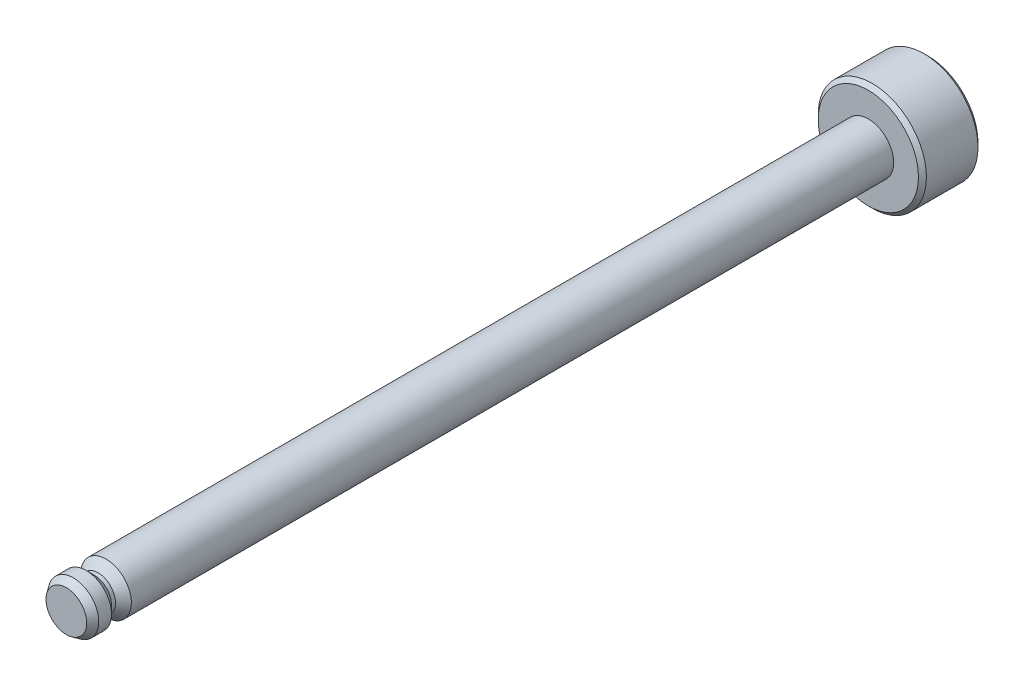
ISO-10303-21;
HEADER;
FILE_DESCRIPTION(('STEP AP214'),'2;1');
FILE_NAME('part.step','',(''),(''),'','','');
FILE_SCHEMA(('AUTOMOTIVE_DESIGN { 1 0 10303 214 1 1 1 1 }'));
ENDSEC;
DATA;
#1=APPLICATION_CONTEXT('core data for automotive mechanical design processes');
#2=APPLICATION_PROTOCOL_DEFINITION('international standard','automotive_design',2000,#1);
#3=PRODUCT_CONTEXT('',#1,'mechanical');
#4=PRODUCT('Part','Part','',(#3));
#5=PRODUCT_RELATED_PRODUCT_CATEGORY('part','',(#4));
#6=PRODUCT_DEFINITION_FORMATION('','',#4);
#7=PRODUCT_DEFINITION_CONTEXT('part definition',#1,'design');
#8=PRODUCT_DEFINITION('design','',#6,#7);
#9=PRODUCT_DEFINITION_SHAPE('','',#8);
#10=(LENGTH_UNIT() NAMED_UNIT(*) SI_UNIT(.MILLI.,.METRE.));
#11=(NAMED_UNIT(*) PLANE_ANGLE_UNIT() SI_UNIT($,.RADIAN.));
#12=(NAMED_UNIT(*) SI_UNIT($,.STERADIAN.) SOLID_ANGLE_UNIT());
#13=UNCERTAINTY_MEASURE_WITH_UNIT(LENGTH_MEASURE(1.E-05),#10,'distance_accuracy_value','');
#14=(GEOMETRIC_REPRESENTATION_CONTEXT(3) GLOBAL_UNCERTAINTY_ASSIGNED_CONTEXT((#13)) GLOBAL_UNIT_ASSIGNED_CONTEXT((#10,
#11,#12)) REPRESENTATION_CONTEXT('',''));
#15=CARTESIAN_POINT('',(0.,0.,0.));
#16=DIRECTION('',(0.,0.,1.));
#17=DIRECTION('',(1.,0.,0.));
#18=AXIS2_PLACEMENT_3D('',#15,#16,#17);
#19=CARTESIAN_POINT('',(0.,0.,40.4));
#20=DIRECTION('',(0.,0.,-1.));
#21=DIRECTION('',(-1.,0.,0.));
#22=AXIS2_PLACEMENT_3D('',#19,#20,#21);
#23=CYLINDRICAL_SURFACE('',#22,1.275);
#24=CARTESIAN_POINT('',(0.,0.,38.4));
#25=DIRECTION('',(0.,0.,-1.));
#26=DIRECTION('',(0.,1.,0.));
#27=AXIS2_PLACEMENT_3D('',#24,#25,#26);
#28=CIRCLE('',#27,1.275);
#29=CARTESIAN_POINT('',(0.,1.275,38.4));
#30=VERTEX_POINT('',#29);
#31=EDGE_CURVE('E74',#30,#30,#28,.T.);
#32=ORIENTED_EDGE('',*,*,#31,.T.);
#33=EDGE_LOOP('',(#32));
#34=FACE_BOUND('',#33,.T.);
#35=CARTESIAN_POINT('',(0.,0.,0.));
#36=DIRECTION('',(0.,0.,1.));
#37=DIRECTION('',(1.,0.,0.));
#38=AXIS2_PLACEMENT_3D('',#35,#36,#37);
#39=CIRCLE('',#38,1.275);
#40=CARTESIAN_POINT('',(1.275,0.,0.));
#41=VERTEX_POINT('',#40);
#42=EDGE_CURVE('E68',#41,#41,#39,.T.);
#43=ORIENTED_EDGE('',*,*,#42,.T.);
#44=EDGE_LOOP('',(#43));
#45=FACE_BOUND('',#44,.T.);
#46=ADVANCED_FACE('F39',(#34,#45),#23,.T.);
#47=CARTESIAN_POINT('',(0.,0.,-3.));
#48=DIRECTION('',(0.,0.,1.));
#49=DIRECTION('',(1.,0.,0.));
#50=AXIS2_PLACEMENT_3D('',#47,#48,#49);
#51=CYLINDRICAL_SURFACE('',#50,2.725);
#52=CARTESIAN_POINT('',(0.,0.,-0.200000000000001));
#53=DIRECTION('',(0.,0.,1.));
#54=DIRECTION('',(1.,0.,0.));
#55=AXIS2_PLACEMENT_3D('',#52,#53,#54);
#56=CIRCLE('',#55,2.725);
#57=CARTESIAN_POINT('',(2.725,0.,-0.200000000000001));
#58=VERTEX_POINT('',#57);
#59=EDGE_CURVE('E50',#58,#58,#56,.F.);
#60=ORIENTED_EDGE('',*,*,#59,.T.);
#61=EDGE_LOOP('',(#60));
#62=FACE_BOUND('',#61,.T.);
#63=CARTESIAN_POINT('',(0.,0.,-2.8));
#64=DIRECTION('',(0.,0.,1.));
#65=DIRECTION('',(1.,0.,0.));
#66=AXIS2_PLACEMENT_3D('',#63,#64,#65);
#67=CIRCLE('',#66,2.725);
#68=CARTESIAN_POINT('',(2.725,0.,-2.8));
#69=VERTEX_POINT('',#68);
#70=EDGE_CURVE('E51',#69,#69,#67,.T.);
#71=ORIENTED_EDGE('',*,*,#70,.T.);
#72=EDGE_LOOP('',(#71));
#73=FACE_BOUND('',#72,.T.);
#74=ADVANCED_FACE('F117',(#62,#73),#51,.T.);
#75=CARTESIAN_POINT('',(0.,0.,-3.));
#76=DIRECTION('',(0.,0.,1.));
#77=DIRECTION('',(1.,0.,0.));
#78=AXIS2_PLACEMENT_3D('',#75,#76,#77);
#79=PLANE('',#78);
#80=CARTESIAN_POINT('',(0.,0.,-3.));
#81=DIRECTION('',(0.,0.,1.));
#82=DIRECTION('',(1.,0.,0.));
#83=AXIS2_PLACEMENT_3D('',#80,#81,#82);
#84=CIRCLE('',#83,2.525);
#85=CARTESIAN_POINT('',(2.525,0.,-3.));
#86=VERTEX_POINT('',#85);
#87=EDGE_CURVE('E10',#86,#86,#84,.F.);
#88=ORIENTED_EDGE('',*,*,#87,.T.);
#89=EDGE_LOOP('',(#88));
#90=FACE_BOUND('',#89,.T.);
#91=ADVANCED_FACE('F121',(#90),#79,.F.);
#92=CARTESIAN_POINT('',(0.,0.,0.));
#93=DIRECTION('',(0.,0.,1.));
#94=DIRECTION('',(1.,0.,0.));
#95=AXIS2_PLACEMENT_3D('',#92,#93,#94);
#96=PLANE('',#95);
#97=CARTESIAN_POINT('',(0.,0.,0.));
#98=DIRECTION('',(0.,0.,1.));
#99=DIRECTION('',(1.,0.,0.));
#100=AXIS2_PLACEMENT_3D('',#97,#98,#99);
#101=CIRCLE('',#100,2.525);
#102=CARTESIAN_POINT('',(2.525,0.,0.));
#103=VERTEX_POINT('',#102);
#104=EDGE_CURVE('E54',#103,#103,#101,.T.);
#105=ORIENTED_EDGE('',*,*,#104,.T.);
#106=EDGE_LOOP('',(#105));
#107=FACE_BOUND('',#106,.T.);
#108=ORIENTED_EDGE('',*,*,#42,.F.);
#109=EDGE_LOOP('',(#108));
#110=FACE_BOUND('',#109,.T.);
#111=ADVANCED_FACE('F135',(#107,#110),#96,.T.);
#112=CARTESIAN_POINT('',(0.,0.,0.));
#113=DIRECTION('',(0.,0.,-1.));
#114=DIRECTION('',(-1.,0.,0.));
#115=AXIS2_PLACEMENT_3D('',#112,#113,#114);
#116=CONICAL_SURFACE('',#115,2.525,0.785398163397446);
#117=ORIENTED_EDGE('',*,*,#59,.F.);
#118=EDGE_LOOP('',(#117));
#119=FACE_BOUND('',#118,.T.);
#120=ORIENTED_EDGE('',*,*,#104,.F.);
#121=EDGE_LOOP('',(#120));
#122=FACE_BOUND('',#121,.T.);
#123=ADVANCED_FACE('F128',(#119,#122),#116,.T.);
#124=CARTESIAN_POINT('',(0.,0.,-2.8));
#125=DIRECTION('',(0.,0.,1.));
#126=DIRECTION('',(1.,0.,0.));
#127=AXIS2_PLACEMENT_3D('',#124,#125,#126);
#128=CONICAL_SURFACE('',#127,2.725,0.785398163397449);
#129=ORIENTED_EDGE('',*,*,#87,.F.);
#130=EDGE_LOOP('',(#129));
#131=FACE_BOUND('',#130,.T.);
#132=ORIENTED_EDGE('',*,*,#70,.F.);
#133=EDGE_LOOP('',(#132));
#134=FACE_BOUND('',#133,.T.);
#135=ADVANCED_FACE('F45',(#131,#134),#128,.T.);
#136=CARTESIAN_POINT('',(0.,0.,0.));
#137=DIRECTION('',(0.,0.,-1.));
#138=DIRECTION('',(0.,1.,0.));
#139=AXIS2_PLACEMENT_3D('',#136,#137,#138);
#140=CYLINDRICAL_SURFACE('',#139,0.875000000000015);
#141=CARTESIAN_POINT('',(0.,0.,38.8));
#142=DIRECTION('',(0.,0.,-1.));
#143=DIRECTION('',(0.,1.,0.));
#144=AXIS2_PLACEMENT_3D('',#141,#142,#143);
#145=CIRCLE('',#144,0.875000000000015);
#146=CARTESIAN_POINT('',(0.,0.87500000000001,38.8));
#147=VERTEX_POINT('',#146);
#148=EDGE_CURVE('E76',#147,#147,#145,.T.);
#149=ORIENTED_EDGE('',*,*,#148,.F.);
#150=EDGE_LOOP('',(#149));
#151=FACE_BOUND('',#150,.T.);
#152=CARTESIAN_POINT('',(0.,0.,39.));
#153=DIRECTION('',(0.,0.,-1.));
#154=DIRECTION('',(0.,1.,0.));
#155=AXIS2_PLACEMENT_3D('',#152,#153,#154);
#156=CIRCLE('',#155,0.875000000000015);
#157=CARTESIAN_POINT('',(0.,0.87500000000001,39.));
#158=VERTEX_POINT('',#157);
#159=EDGE_CURVE('E70',#158,#158,#156,.T.);
#160=ORIENTED_EDGE('',*,*,#159,.T.);
#161=EDGE_LOOP('',(#160));
#162=FACE_BOUND('',#161,.T.);
#163=ADVANCED_FACE('F81',(#151,#162),#140,.T.);
#164=CARTESIAN_POINT('',(0.,0.,39.4));
#165=DIRECTION('',(0.,0.,1.));
#166=DIRECTION('',(0.,-1.,0.));
#167=AXIS2_PLACEMENT_3D('',#164,#165,#166);
#168=CONICAL_SURFACE('',#167,1.275,0.785398163397448);
#169=ORIENTED_EDGE('',*,*,#159,.F.);
#170=EDGE_LOOP('',(#169));
#171=FACE_BOUND('',#170,.T.);
#172=CARTESIAN_POINT('',(0.,0.,39.4));
#173=DIRECTION('',(0.,0.,-1.));
#174=DIRECTION('',(0.,1.,0.));
#175=AXIS2_PLACEMENT_3D('',#172,#173,#174);
#176=CIRCLE('',#175,1.275);
#177=CARTESIAN_POINT('',(0.,1.275,39.4));
#178=VERTEX_POINT('',#177);
#179=EDGE_CURVE('E75',#178,#178,#176,.T.);
#180=ORIENTED_EDGE('',*,*,#179,.T.);
#181=EDGE_LOOP('',(#180));
#182=FACE_BOUND('',#181,.T.);
#183=ADVANCED_FACE('F90',(#171,#182),#168,.T.);
#184=CARTESIAN_POINT('',(0.,0.,38.8));
#185=DIRECTION('',(0.,0.,-1.));
#186=DIRECTION('',(0.,1.,0.));
#187=AXIS2_PLACEMENT_3D('',#184,#185,#186);
#188=CONICAL_SURFACE('',#187,0.875000000000015,0.785398163397448);
#189=ORIENTED_EDGE('',*,*,#31,.F.);
#190=EDGE_LOOP('',(#189));
#191=FACE_BOUND('',#190,.T.);
#192=ORIENTED_EDGE('',*,*,#148,.T.);
#193=EDGE_LOOP('',(#192));
#194=FACE_BOUND('',#193,.T.);
#195=ADVANCED_FACE('F85',(#191,#194),#188,.T.);
#196=CARTESIAN_POINT('',(0.,0.,40.4));
#197=DIRECTION('',(0.,0.,1.));
#198=DIRECTION('',(1.,0.,0.));
#199=AXIS2_PLACEMENT_3D('',#196,#197,#198);
#200=PLANE('',#199);
#201=CARTESIAN_POINT('',(0.,0.,40.4));
#202=DIRECTION('',(0.,0.,1.));
#203=DIRECTION('',(1.,0.,0.));
#204=AXIS2_PLACEMENT_3D('',#201,#202,#203);
#205=CIRCLE('',#204,1.02499999999999);
#206=CARTESIAN_POINT('',(-1.02499999999999,0.,40.4));
#207=VERTEX_POINT('',#206);
#208=EDGE_CURVE('E64',#207,#207,#205,.T.);
#209=ORIENTED_EDGE('',*,*,#208,.T.);
#210=EDGE_LOOP('',(#209));
#211=FACE_BOUND('',#210,.T.);
#212=ADVANCED_FACE('F102',(#211),#200,.T.);
#213=CARTESIAN_POINT('',(0.,0.,40.4));
#214=DIRECTION('',(0.,0.,-1.));
#215=DIRECTION('',(-1.,0.,0.));
#216=AXIS2_PLACEMENT_3D('',#213,#214,#215);
#217=CONICAL_SURFACE('',#216,1.02499999999999,0.610865238198019);
#218=CARTESIAN_POINT('',(0.,0.,40.0429629983145));
#219=DIRECTION('',(0.,0.,1.));
#220=DIRECTION('',(1.,0.,0.));
#221=AXIS2_PLACEMENT_3D('',#218,#219,#220);
#222=CIRCLE('',#221,1.275);
#223=CARTESIAN_POINT('',(-1.275,0.,40.0429629983145));
#224=VERTEX_POINT('',#223);
#225=EDGE_CURVE('E58',#224,#224,#222,.F.);
#226=CARTESIAN_POINT('',(-1.275,0.,40.0429629983145));
#227=CARTESIAN_POINT('',(-1.27239583333334,0.,40.0466821337487));
#228=CARTESIAN_POINT('',(-1.26979166666667,0.,40.0504012691829));
#229=CARTESIAN_POINT('',(-1.26458333333334,0.,40.0578395400514));
#230=CARTESIAN_POINT('',(-1.26197916666667,0.,40.0615586754856));
#231=CARTESIAN_POINT('',(-1.25677083333333,0.,40.068996946354));
#232=CARTESIAN_POINT('',(-1.25416666666667,0.,40.0727160817883));
#233=CARTESIAN_POINT('',(-1.24895833333334,0.,40.0801543526567));
#234=CARTESIAN_POINT('',(-1.24635416666667,0.,40.0838734880909));
#235=CARTESIAN_POINT('',(-1.24114583333333,0.,40.0913117589594));
#236=CARTESIAN_POINT('',(-1.23854166666667,0.,40.0950308943936));
#237=CARTESIAN_POINT('',(-1.23333333333333,0.,40.1024691652621));
#238=CARTESIAN_POINT('',(-1.23072916666667,0.,40.1061883006963));
#239=CARTESIAN_POINT('',(-1.22552083333333,0.,40.1136265715647));
#240=CARTESIAN_POINT('',(-1.22291666666667,0.,40.1173457069989));
#241=CARTESIAN_POINT('',(-1.21770833333333,0.,40.1247839778674));
#242=CARTESIAN_POINT('',(-1.21510416666667,0.,40.1285031133016));
#243=CARTESIAN_POINT('',(-1.20989583333333,0.,40.1359413841701));
#244=CARTESIAN_POINT('',(-1.20729166666667,0.,40.1396605196043));
#245=CARTESIAN_POINT('',(-1.20208333333333,0.,40.1470987904727));
#246=CARTESIAN_POINT('',(-1.19947916666667,0.,40.150817925907));
#247=CARTESIAN_POINT('',(-1.19427083333333,0.,40.1582561967754));
#248=CARTESIAN_POINT('',(-1.19166666666667,0.,40.1619753322096));
#249=CARTESIAN_POINT('',(-1.18645833333333,0.,40.1694136030781));
#250=CARTESIAN_POINT('',(-1.18385416666667,0.,40.1731327385123));
#251=CARTESIAN_POINT('',(-1.17864583333333,0.,40.1805710093808));
#252=CARTESIAN_POINT('',(-1.17604166666667,0.,40.184290144815));
#253=CARTESIAN_POINT('',(-1.17083333333333,0.,40.1917284156834));
#254=CARTESIAN_POINT('',(-1.16822916666666,0.,40.1954475511177));
#255=CARTESIAN_POINT('',(-1.16302083333333,0.,40.2028858219861));
#256=CARTESIAN_POINT('',(-1.16041666666667,0.,40.2066049574203));
#257=CARTESIAN_POINT('',(-1.15520833333333,0.,40.2140432282888));
#258=CARTESIAN_POINT('',(-1.15260416666667,0.,40.217762363723));
#259=CARTESIAN_POINT('',(-1.14739583333333,0.,40.2252006345915));
#260=CARTESIAN_POINT('',(-1.14479166666666,0.,40.2289197700257));
#261=CARTESIAN_POINT('',(-1.13958333333333,0.,40.2363580408941));
#262=CARTESIAN_POINT('',(-1.13697916666666,0.,40.2400771763283));
#263=CARTESIAN_POINT('',(-1.13177083333333,0.,40.2475154471968));
#264=CARTESIAN_POINT('',(-1.12916666666666,0.,40.251234582631));
#265=CARTESIAN_POINT('',(-1.12395833333333,0.,40.2586728534995));
#266=CARTESIAN_POINT('',(-1.12135416666666,0.,40.2623919889337));
#267=CARTESIAN_POINT('',(-1.11614583333333,0.,40.2698302598021));
#268=CARTESIAN_POINT('',(-1.11354166666666,0.,40.2735493952364));
#269=CARTESIAN_POINT('',(-1.10833333333333,0.,40.2809876661048));
#270=CARTESIAN_POINT('',(-1.10572916666666,0.,40.284706801539));
#271=CARTESIAN_POINT('',(-1.10052083333333,0.,40.2921450724075));
#272=CARTESIAN_POINT('',(-1.09791666666666,0.,40.2958642078417));
#273=CARTESIAN_POINT('',(-1.09270833333333,0.,40.3033024787102));
#274=CARTESIAN_POINT('',(-1.09010416666666,0.,40.3070216141444));
#275=CARTESIAN_POINT('',(-1.08489583333333,0.,40.3144598850128));
#276=CARTESIAN_POINT('',(-1.08229166666666,0.,40.3181790204471));
#277=CARTESIAN_POINT('',(-1.07708333333333,0.,40.3256172913155));
#278=CARTESIAN_POINT('',(-1.07447916666666,0.,40.3293364267497));
#279=CARTESIAN_POINT('',(-1.06927083333333,0.,40.3367746976182));
#280=CARTESIAN_POINT('',(-1.06666666666666,0.,40.3404938330524));
#281=CARTESIAN_POINT('',(-1.06145833333333,0.,40.3479321039209));
#282=CARTESIAN_POINT('',(-1.05885416666666,0.,40.3516512393551));
#283=CARTESIAN_POINT('',(-1.05364583333333,0.,40.3590895102235));
#284=CARTESIAN_POINT('',(-1.05104166666666,0.,40.3628086456578));
#285=CARTESIAN_POINT('',(-1.04583333333333,0.,40.3702469165262));
#286=CARTESIAN_POINT('',(-1.04322916666666,0.,40.3739660519604));
#287=CARTESIAN_POINT('',(-1.03802083333333,0.,40.3814043228289));
#288=CARTESIAN_POINT('',(-1.03541666666666,0.,40.3851234582631));
#289=CARTESIAN_POINT('',(-1.03020833333333,0.,40.3925617291316));
#290=CARTESIAN_POINT('',(-1.02760416666666,0.,40.3962808645658));
#291=CARTESIAN_POINT('',(-1.02499999999999,0.,40.4));
#292=B_SPLINE_CURVE_WITH_KNOTS('',3,(#226,#227,#228,#229,#230,#231,#232,#233,#234,#235,#236,
#237,#238,#239,#240,#241,#242,#243,#244,#245,#246,#247,#248,#249,#250,#251,#252,#253,#254,#255,
#256,#257,#258,#259,#260,#261,#262,#263,#264,#265,#266,#267,#268,#269,#270,#271,#272,#273,#274,
#275,#276,#277,#278,#279,#280,#281,#282,#283,#284,#285,#286,#287,#288,#289,#290,#291),
.UNSPECIFIED.,.F.,.F.,(4,2,2,2,2,2,2,2,2,2,2,2,2,2,2,2,2,2,2,2,2,2,2,2,2,2,2,2,2,2,2,2,4),(0.,
0.0136206780907932,0.0272413561815808,0.040862034272374,0.0544827123631615,0.0681033904539549,
0.0817240685447424,0.0953447466355356,0.108965424726323,0.122586102817117,0.136206780907904,
0.149827458998697,0.163448137089485,0.177068815180278,0.190689493271066,0.204310171361859,
0.217930849452646,0.231551527543434,0.245172205634227,0.258792883725015,0.272413561815808,
0.286034239906596,0.299654917997389,0.313275596088176,0.32689627417897,0.340516952269757,
0.354137630360551,0.367758308451338,0.381378986542131,0.394999664632919,0.408620342723712,
0.4222410208145,0.435861698905293),.UNSPECIFIED.);
#293=EDGE_CURVE('BSEAM100',#224,#207,#292,.T.);
#294=ORIENTED_EDGE('',*,*,#225,.F.);
#295=ORIENTED_EDGE('',*,*,#208,.F.);
#296=ORIENTED_EDGE('',*,*,#293,.T.);
#297=ORIENTED_EDGE('',*,*,#293,.F.);
#298=EDGE_LOOP('',(#294,#296,#295,#297));
#299=FACE_BOUND('',#298,.T.);
#300=ADVANCED_FACE('F100',(#299),#217,.T.);
#301=ORIENTED_EDGE('',*,*,#179,.F.);
#302=EDGE_LOOP('',(#301));
#303=FACE_BOUND('',#302,.T.);
#304=ORIENTED_EDGE('',*,*,#225,.T.);
#305=EDGE_LOOP('',(#304));
#306=FACE_BOUND('',#305,.T.);
#307=ADVANCED_FACE('F98',(#303,#306),#23,.T.);
#308=CLOSED_SHELL('',(#46,#74,#91,#111,#123,#135,#163,#183,#195,#212,#300,#307));
#309=MANIFOLD_SOLID_BREP('B2',#308);
#310=ADVANCED_BREP_SHAPE_REPRESENTATION('',(#18,#309),#14);
#311=SHAPE_DEFINITION_REPRESENTATION(#9,#310);
ENDSEC;
END-ISO-10303-21;
